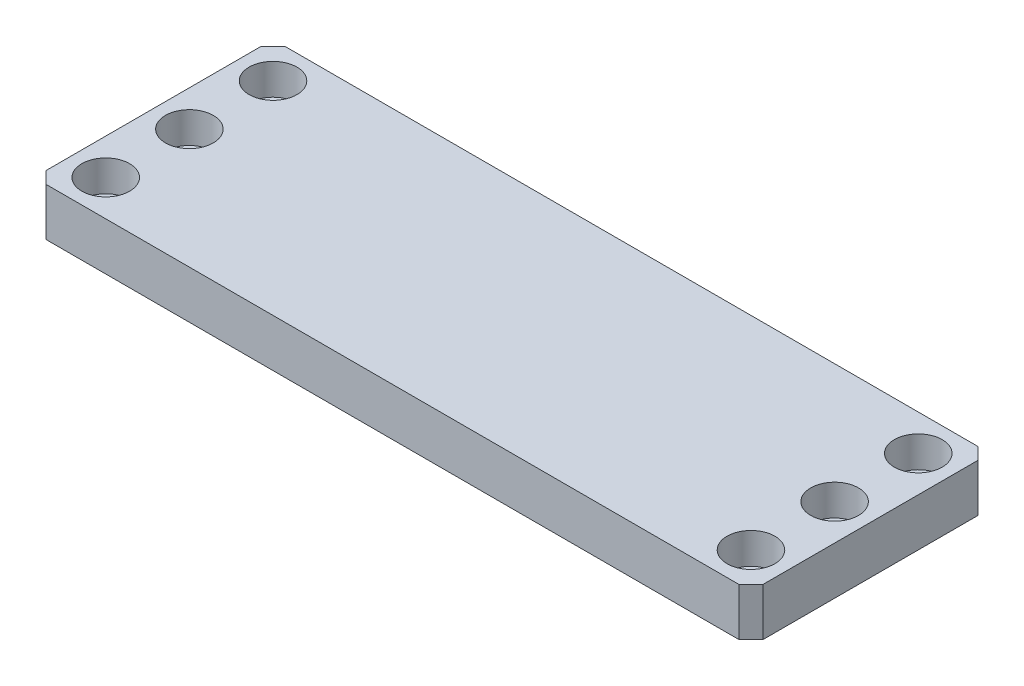
ISO-10303-21;
HEADER;
FILE_DESCRIPTION(('STEP AP214'),'2;1');
FILE_NAME('part.step','',(''),(''),'','','');
FILE_SCHEMA(('AUTOMOTIVE_DESIGN { 1 0 10303 214 1 1 1 1 }'));
ENDSEC;
DATA;
#1=APPLICATION_CONTEXT('core data for automotive mechanical design processes');
#2=APPLICATION_PROTOCOL_DEFINITION('international standard','automotive_design',2000,#1);
#3=PRODUCT_CONTEXT('',#1,'mechanical');
#4=PRODUCT('Part','Part','',(#3));
#5=PRODUCT_RELATED_PRODUCT_CATEGORY('part','',(#4));
#6=PRODUCT_DEFINITION_FORMATION('','',#4);
#7=PRODUCT_DEFINITION_CONTEXT('part definition',#1,'design');
#8=PRODUCT_DEFINITION('design','',#6,#7);
#9=PRODUCT_DEFINITION_SHAPE('','',#8);
#10=(LENGTH_UNIT() NAMED_UNIT(*) SI_UNIT(.MILLI.,.METRE.));
#11=(NAMED_UNIT(*) PLANE_ANGLE_UNIT() SI_UNIT($,.RADIAN.));
#12=(NAMED_UNIT(*) SI_UNIT($,.STERADIAN.) SOLID_ANGLE_UNIT());
#13=UNCERTAINTY_MEASURE_WITH_UNIT(LENGTH_MEASURE(1.E-05),#10,'distance_accuracy_value','');
#14=(GEOMETRIC_REPRESENTATION_CONTEXT(3) GLOBAL_UNCERTAINTY_ASSIGNED_CONTEXT((#13)) GLOBAL_UNIT_ASSIGNED_CONTEXT((#10,
#11,#12)) REPRESENTATION_CONTEXT('',''));
#15=CARTESIAN_POINT('',(0.,0.,0.));
#16=DIRECTION('',(0.,0.,1.));
#17=DIRECTION('',(1.,0.,0.));
#18=AXIS2_PLACEMENT_3D('',#15,#16,#17);
#19=CARTESIAN_POINT('',(-150.,20.,50.));
#20=DIRECTION('',(1.,0.,0.));
#21=DIRECTION('',(0.,0.,-1.));
#22=AXIS2_PLACEMENT_3D('',#19,#20,#21);
#23=PLANE('',#22);
#24=DIRECTION('',(0.,0.,1.));
#25=VECTOR('',#24,1.);
#26=CARTESIAN_POINT('',(-150.,20.,50.));
#27=LINE('',#26,#25);
#28=CARTESIAN_POINT('',(-150.,20.,-45.));
#29=VERTEX_POINT('',#28);
#30=CARTESIAN_POINT('',(-150.,20.,45.));
#31=VERTEX_POINT('',#30);
#32=EDGE_CURVE('E266',#29,#31,#27,.T.);
#33=ORIENTED_EDGE('',*,*,#32,.F.);
#34=DIRECTION('',(0.,-1.,0.));
#35=VECTOR('',#34,1.);
#36=CARTESIAN_POINT('',(-150.,20.,-45.));
#37=LINE('',#36,#35);
#38=CARTESIAN_POINT('',(-150.,0.,-45.));
#39=VERTEX_POINT('',#38);
#40=EDGE_CURVE('E11',#29,#39,#37,.T.);
#41=ORIENTED_EDGE('',*,*,#40,.T.);
#42=DIRECTION('',(0.,0.,1.));
#43=VECTOR('',#42,1.);
#44=CARTESIAN_POINT('',(-150.,0.,50.));
#45=LINE('',#44,#43);
#46=CARTESIAN_POINT('',(-150.,0.,45.));
#47=VERTEX_POINT('',#46);
#48=EDGE_CURVE('E265',#39,#47,#45,.T.);
#49=ORIENTED_EDGE('',*,*,#48,.T.);
#50=DIRECTION('',(0.,1.,0.));
#51=VECTOR('',#50,1.);
#52=CARTESIAN_POINT('',(-150.,20.,45.));
#53=LINE('',#52,#51);
#54=EDGE_CURVE('E59',#47,#31,#53,.T.);
#55=ORIENTED_EDGE('',*,*,#54,.T.);
#56=EDGE_LOOP('',(#33,#41,#49,#55));
#57=FACE_BOUND('',#56,.T.);
#58=ADVANCED_FACE('F49',(#57),#23,.F.);
#59=CARTESIAN_POINT('',(150.,20.,50.));
#60=DIRECTION('',(0.,0.,-1.));
#61=DIRECTION('',(-1.,0.,0.));
#62=AXIS2_PLACEMENT_3D('',#59,#60,#61);
#63=PLANE('',#62);
#64=DIRECTION('',(1.,0.,0.));
#65=VECTOR('',#64,1.);
#66=CARTESIAN_POINT('',(150.,0.,50.));
#67=LINE('',#66,#65);
#68=CARTESIAN_POINT('',(-145.,0.,50.));
#69=VERTEX_POINT('',#68);
#70=CARTESIAN_POINT('',(145.,0.,50.));
#71=VERTEX_POINT('',#70);
#72=EDGE_CURVE('E285',#69,#71,#67,.T.);
#73=ORIENTED_EDGE('',*,*,#72,.T.);
#74=DIRECTION('',(0.,1.,0.));
#75=VECTOR('',#74,1.);
#76=CARTESIAN_POINT('',(145.,20.,50.));
#77=LINE('',#76,#75);
#78=CARTESIAN_POINT('',(145.,20.,50.));
#79=VERTEX_POINT('',#78);
#80=EDGE_CURVE('E66',#71,#79,#77,.T.);
#81=ORIENTED_EDGE('',*,*,#80,.T.);
#82=DIRECTION('',(1.,0.,0.));
#83=VECTOR('',#82,1.);
#84=CARTESIAN_POINT('',(150.,20.,50.));
#85=LINE('',#84,#83);
#86=CARTESIAN_POINT('',(-145.,20.,50.));
#87=VERTEX_POINT('',#86);
#88=EDGE_CURVE('E269',#87,#79,#85,.T.);
#89=ORIENTED_EDGE('',*,*,#88,.F.);
#90=DIRECTION('',(0.,-1.,0.));
#91=VECTOR('',#90,1.);
#92=CARTESIAN_POINT('',(-145.,20.,50.));
#93=LINE('',#92,#91);
#94=EDGE_CURVE('E331',#87,#69,#93,.T.);
#95=ORIENTED_EDGE('',*,*,#94,.T.);
#96=EDGE_LOOP('',(#73,#81,#89,#95));
#97=FACE_BOUND('',#96,.T.);
#98=ADVANCED_FACE('F347',(#97),#63,.F.);
#99=CARTESIAN_POINT('',(150.,20.,50.));
#100=DIRECTION('',(-1.,0.,0.));
#101=DIRECTION('',(0.,0.,1.));
#102=AXIS2_PLACEMENT_3D('',#99,#100,#101);
#103=PLANE('',#102);
#104=DIRECTION('',(0.,0.,-1.));
#105=VECTOR('',#104,1.);
#106=CARTESIAN_POINT('',(150.,0.,50.));
#107=LINE('',#106,#105);
#108=CARTESIAN_POINT('',(150.,0.,45.));
#109=VERTEX_POINT('',#108);
#110=CARTESIAN_POINT('',(150.,0.,-45.));
#111=VERTEX_POINT('',#110);
#112=EDGE_CURVE('E288',#109,#111,#107,.T.);
#113=ORIENTED_EDGE('',*,*,#112,.T.);
#114=DIRECTION('',(0.,1.,0.));
#115=VECTOR('',#114,1.);
#116=CARTESIAN_POINT('',(150.,20.,-45.));
#117=LINE('',#116,#115);
#118=CARTESIAN_POINT('',(150.,20.,-45.));
#119=VERTEX_POINT('',#118);
#120=EDGE_CURVE('E317',#111,#119,#117,.T.);
#121=ORIENTED_EDGE('',*,*,#120,.T.);
#122=DIRECTION('',(0.,0.,-1.));
#123=VECTOR('',#122,1.);
#124=CARTESIAN_POINT('',(150.,20.,50.));
#125=LINE('',#124,#123);
#126=CARTESIAN_POINT('',(150.,20.,45.));
#127=VERTEX_POINT('',#126);
#128=EDGE_CURVE('E273',#127,#119,#125,.T.);
#129=ORIENTED_EDGE('',*,*,#128,.F.);
#130=DIRECTION('',(0.,-1.,0.));
#131=VECTOR('',#130,1.);
#132=CARTESIAN_POINT('',(150.,20.,45.));
#133=LINE('',#132,#131);
#134=EDGE_CURVE('E313',#127,#109,#133,.T.);
#135=ORIENTED_EDGE('',*,*,#134,.T.);
#136=EDGE_LOOP('',(#113,#121,#129,#135));
#137=FACE_BOUND('',#136,.T.);
#138=ADVANCED_FACE('F358',(#137),#103,.F.);
#139=CARTESIAN_POINT('',(150.,20.,-50.));
#140=DIRECTION('',(0.,0.,1.));
#141=DIRECTION('',(1.,0.,0.));
#142=AXIS2_PLACEMENT_3D('',#139,#140,#141);
#143=PLANE('',#142);
#144=DIRECTION('',(-1.,0.,0.));
#145=VECTOR('',#144,1.);
#146=CARTESIAN_POINT('',(150.,20.,-50.));
#147=LINE('',#146,#145);
#148=CARTESIAN_POINT('',(145.,20.,-50.));
#149=VERTEX_POINT('',#148);
#150=CARTESIAN_POINT('',(-145.,20.,-50.));
#151=VERTEX_POINT('',#150);
#152=EDGE_CURVE('E277',#149,#151,#147,.T.);
#153=ORIENTED_EDGE('',*,*,#152,.F.);
#154=DIRECTION('',(0.,-1.,0.));
#155=VECTOR('',#154,1.);
#156=CARTESIAN_POINT('',(145.,20.,-50.));
#157=LINE('',#156,#155);
#158=CARTESIAN_POINT('',(145.,0.,-50.));
#159=VERTEX_POINT('',#158);
#160=EDGE_CURVE('E297',#149,#159,#157,.T.);
#161=ORIENTED_EDGE('',*,*,#160,.T.);
#162=DIRECTION('',(-1.,0.,0.));
#163=VECTOR('',#162,1.);
#164=CARTESIAN_POINT('',(150.,0.,-50.));
#165=LINE('',#164,#163);
#166=CARTESIAN_POINT('',(-145.,0.,-50.));
#167=VERTEX_POINT('',#166);
#168=EDGE_CURVE('E270',#159,#167,#165,.T.);
#169=ORIENTED_EDGE('',*,*,#168,.T.);
#170=DIRECTION('',(0.,1.,0.));
#171=VECTOR('',#170,1.);
#172=CARTESIAN_POINT('',(-145.,20.,-50.));
#173=LINE('',#172,#171);
#174=EDGE_CURVE('E281',#167,#151,#173,.T.);
#175=ORIENTED_EDGE('',*,*,#174,.T.);
#176=EDGE_LOOP('',(#153,#161,#169,#175));
#177=FACE_BOUND('',#176,.T.);
#178=ADVANCED_FACE('F366',(#177),#143,.F.);
#179=CARTESIAN_POINT('',(0.,20.,0.));
#180=DIRECTION('',(0.,1.,0.));
#181=DIRECTION('',(0.,0.,1.));
#182=AXIS2_PLACEMENT_3D('',#179,#180,#181);
#183=PLANE('',#182);
#184=CARTESIAN_POINT('',(-135.,20.,-35.));
#185=DIRECTION('',(0.,1.,0.));
#186=DIRECTION('',(0.,0.,1.));
#187=AXIS2_PLACEMENT_3D('',#184,#185,#186);
#188=CIRCLE('',#187,10.);
#189=CARTESIAN_POINT('',(-135.,20.,-25.));
#190=VERTEX_POINT('',#189);
#191=EDGE_CURVE('E169',#190,#190,#188,.T.);
#192=ORIENTED_EDGE('',*,*,#191,.F.);
#193=EDGE_LOOP('',(#192));
#194=FACE_BOUND('',#193,.T.);
#195=CARTESIAN_POINT('',(-135.,20.,35.));
#196=DIRECTION('',(0.,1.,0.));
#197=DIRECTION('',(0.,0.,1.));
#198=AXIS2_PLACEMENT_3D('',#195,#196,#197);
#199=CIRCLE('',#198,10.);
#200=CARTESIAN_POINT('',(-135.,20.,45.));
#201=VERTEX_POINT('',#200);
#202=EDGE_CURVE('E185',#201,#201,#199,.T.);
#203=ORIENTED_EDGE('',*,*,#202,.F.);
#204=EDGE_LOOP('',(#203));
#205=FACE_BOUND('',#204,.T.);
#206=CARTESIAN_POINT('',(-135.,20.,0.));
#207=DIRECTION('',(0.,1.,0.));
#208=DIRECTION('',(0.,0.,1.));
#209=AXIS2_PLACEMENT_3D('',#206,#207,#208);
#210=CIRCLE('',#209,10.);
#211=CARTESIAN_POINT('',(-135.,20.,10.));
#212=VERTEX_POINT('',#211);
#213=EDGE_CURVE('E201',#212,#212,#210,.T.);
#214=ORIENTED_EDGE('',*,*,#213,.F.);
#215=EDGE_LOOP('',(#214));
#216=FACE_BOUND('',#215,.T.);
#217=CARTESIAN_POINT('',(135.,20.,0.));
#218=DIRECTION('',(0.,1.,0.));
#219=DIRECTION('',(0.,0.,1.));
#220=AXIS2_PLACEMENT_3D('',#217,#218,#219);
#221=CIRCLE('',#220,10.);
#222=CARTESIAN_POINT('',(135.,20.,10.));
#223=VERTEX_POINT('',#222);
#224=EDGE_CURVE('E217',#223,#223,#221,.T.);
#225=ORIENTED_EDGE('',*,*,#224,.F.);
#226=EDGE_LOOP('',(#225));
#227=FACE_BOUND('',#226,.T.);
#228=CARTESIAN_POINT('',(135.,20.,35.));
#229=DIRECTION('',(0.,1.,0.));
#230=DIRECTION('',(0.,0.,1.));
#231=AXIS2_PLACEMENT_3D('',#228,#229,#230);
#232=CIRCLE('',#231,10.);
#233=CARTESIAN_POINT('',(135.,20.,45.));
#234=VERTEX_POINT('',#233);
#235=EDGE_CURVE('E233',#234,#234,#232,.T.);
#236=ORIENTED_EDGE('',*,*,#235,.F.);
#237=EDGE_LOOP('',(#236));
#238=FACE_BOUND('',#237,.T.);
#239=CARTESIAN_POINT('',(135.,20.,-35.));
#240=DIRECTION('',(0.,1.,0.));
#241=DIRECTION('',(0.,0.,1.));
#242=AXIS2_PLACEMENT_3D('',#239,#240,#241);
#243=CIRCLE('',#242,10.);
#244=CARTESIAN_POINT('',(135.,20.,-25.));
#245=VERTEX_POINT('',#244);
#246=EDGE_CURVE('E249',#245,#245,#243,.T.);
#247=ORIENTED_EDGE('',*,*,#246,.F.);
#248=EDGE_LOOP('',(#247));
#249=FACE_BOUND('',#248,.T.);
#250=ORIENTED_EDGE('',*,*,#128,.T.);
#251=DIRECTION('',(0.707106781186544,0.,0.707106781186551));
#252=VECTOR('',#251,1.);
#253=CARTESIAN_POINT('',(97.5000000000009,20.,-97.4999999999998));
#254=LINE('',#253,#252);
#255=EDGE_CURVE('E328',#119,#149,#254,.F.);
#256=ORIENTED_EDGE('',*,*,#255,.T.);
#257=ORIENTED_EDGE('',*,*,#152,.T.);
#258=DIRECTION('',(0.70710678118655,0.,-0.707106781186545));
#259=VECTOR('',#258,1.);
#260=CARTESIAN_POINT('',(-97.4999999999994,20.,-97.5000000000002));
#261=LINE('',#260,#259);
#262=EDGE_CURVE('E322',#151,#29,#261,.F.);
#263=ORIENTED_EDGE('',*,*,#262,.T.);
#264=ORIENTED_EDGE('',*,*,#32,.T.);
#265=DIRECTION('',(-0.707106781186544,0.,-0.707106781186551));
#266=VECTOR('',#265,1.);
#267=CARTESIAN_POINT('',(-97.5000000000008,20.,97.4999999999997));
#268=LINE('',#267,#266);
#269=EDGE_CURVE('E73',#31,#87,#268,.F.);
#270=ORIENTED_EDGE('',*,*,#269,.T.);
#271=ORIENTED_EDGE('',*,*,#88,.T.);
#272=DIRECTION('',(-0.707106781186548,0.,0.707106781186548));
#273=VECTOR('',#272,1.);
#274=CARTESIAN_POINT('',(97.5,20.,97.5));
#275=LINE('',#274,#273);
#276=EDGE_CURVE('E325',#79,#127,#275,.F.);
#277=ORIENTED_EDGE('',*,*,#276,.T.);
#278=EDGE_LOOP('',(#250,#256,#257,#263,#264,#270,#271,#277));
#279=FACE_BOUND('',#278,.T.);
#280=ADVANCED_FACE('F343',(#194,#205,#216,#227,#238,#249,#279),#183,.T.);
#281=CARTESIAN_POINT('',(0.,0.,0.));
#282=DIRECTION('',(0.,1.,0.));
#283=DIRECTION('',(0.,0.,1.));
#284=AXIS2_PLACEMENT_3D('',#281,#282,#283);
#285=PLANE('',#284);
#286=CARTESIAN_POINT('',(37.8,0.,-37.8));
#287=DIRECTION('',(0.,-1.,0.));
#288=DIRECTION('',(0.,0.,-1.));
#289=AXIS2_PLACEMENT_3D('',#286,#287,#288);
#290=CIRCLE('',#289,3.39999999999999);
#291=CARTESIAN_POINT('',(37.8,0.,-41.2));
#292=VERTEX_POINT('',#291);
#293=EDGE_CURVE('E140',#292,#292,#290,.T.);
#294=ORIENTED_EDGE('',*,*,#293,.F.);
#295=EDGE_LOOP('',(#294));
#296=FACE_BOUND('',#295,.T.);
#297=CARTESIAN_POINT('',(-37.8,0.,-37.8));
#298=DIRECTION('',(0.,-1.,0.));
#299=DIRECTION('',(0.,0.,-1.));
#300=AXIS2_PLACEMENT_3D('',#297,#298,#299);
#301=CIRCLE('',#300,3.39999999999999);
#302=CARTESIAN_POINT('',(-37.8,0.,-41.2));
#303=VERTEX_POINT('',#302);
#304=EDGE_CURVE('E139',#303,#303,#301,.T.);
#305=ORIENTED_EDGE('',*,*,#304,.F.);
#306=EDGE_LOOP('',(#305));
#307=FACE_BOUND('',#306,.T.);
#308=CARTESIAN_POINT('',(-37.8,0.,37.8));
#309=DIRECTION('',(0.,-1.,0.));
#310=DIRECTION('',(0.,0.,-1.));
#311=AXIS2_PLACEMENT_3D('',#308,#309,#310);
#312=CIRCLE('',#311,3.39999999999999);
#313=CARTESIAN_POINT('',(-37.8,0.,34.4));
#314=VERTEX_POINT('',#313);
#315=EDGE_CURVE('E153',#314,#314,#312,.T.);
#316=ORIENTED_EDGE('',*,*,#315,.F.);
#317=EDGE_LOOP('',(#316));
#318=FACE_BOUND('',#317,.T.);
#319=CARTESIAN_POINT('',(37.8,0.,37.8));
#320=DIRECTION('',(0.,-1.,0.));
#321=DIRECTION('',(0.,0.,-1.));
#322=AXIS2_PLACEMENT_3D('',#319,#320,#321);
#323=CIRCLE('',#322,3.39999999999999);
#324=CARTESIAN_POINT('',(37.8,0.,34.4));
#325=VERTEX_POINT('',#324);
#326=EDGE_CURVE('E161',#325,#325,#323,.T.);
#327=ORIENTED_EDGE('',*,*,#326,.F.);
#328=EDGE_LOOP('',(#327));
#329=FACE_BOUND('',#328,.T.);
#330=CARTESIAN_POINT('',(-135.,0.,-35.));
#331=DIRECTION('',(0.,1.,0.));
#332=DIRECTION('',(0.,0.,1.));
#333=AXIS2_PLACEMENT_3D('',#330,#331,#332);
#334=CIRCLE('',#333,6.75000000000001);
#335=CARTESIAN_POINT('',(-135.,0.,-28.25));
#336=VERTEX_POINT('',#335);
#337=EDGE_CURVE('E181',#336,#336,#334,.T.);
#338=ORIENTED_EDGE('',*,*,#337,.T.);
#339=EDGE_LOOP('',(#338));
#340=FACE_BOUND('',#339,.T.);
#341=CARTESIAN_POINT('',(-135.,0.,35.));
#342=DIRECTION('',(0.,1.,0.));
#343=DIRECTION('',(0.,0.,1.));
#344=AXIS2_PLACEMENT_3D('',#341,#342,#343);
#345=CIRCLE('',#344,6.75000000000001);
#346=CARTESIAN_POINT('',(-135.,0.,41.75));
#347=VERTEX_POINT('',#346);
#348=EDGE_CURVE('E197',#347,#347,#345,.T.);
#349=ORIENTED_EDGE('',*,*,#348,.T.);
#350=EDGE_LOOP('',(#349));
#351=FACE_BOUND('',#350,.T.);
#352=CARTESIAN_POINT('',(-135.,0.,0.));
#353=DIRECTION('',(0.,1.,0.));
#354=DIRECTION('',(0.,0.,1.));
#355=AXIS2_PLACEMENT_3D('',#352,#353,#354);
#356=CIRCLE('',#355,6.75000000000001);
#357=CARTESIAN_POINT('',(-135.,0.,6.75000000000001));
#358=VERTEX_POINT('',#357);
#359=EDGE_CURVE('E213',#358,#358,#356,.T.);
#360=ORIENTED_EDGE('',*,*,#359,.T.);
#361=EDGE_LOOP('',(#360));
#362=FACE_BOUND('',#361,.T.);
#363=CARTESIAN_POINT('',(135.,0.,0.));
#364=DIRECTION('',(0.,1.,0.));
#365=DIRECTION('',(0.,0.,1.));
#366=AXIS2_PLACEMENT_3D('',#363,#364,#365);
#367=CIRCLE('',#366,6.75000000000001);
#368=CARTESIAN_POINT('',(135.,0.,6.75000000000001));
#369=VERTEX_POINT('',#368);
#370=EDGE_CURVE('E229',#369,#369,#367,.T.);
#371=ORIENTED_EDGE('',*,*,#370,.T.);
#372=EDGE_LOOP('',(#371));
#373=FACE_BOUND('',#372,.T.);
#374=CARTESIAN_POINT('',(135.,0.,35.));
#375=DIRECTION('',(0.,1.,0.));
#376=DIRECTION('',(0.,0.,1.));
#377=AXIS2_PLACEMENT_3D('',#374,#375,#376);
#378=CIRCLE('',#377,6.75000000000001);
#379=CARTESIAN_POINT('',(135.,0.,41.75));
#380=VERTEX_POINT('',#379);
#381=EDGE_CURVE('E245',#380,#380,#378,.T.);
#382=ORIENTED_EDGE('',*,*,#381,.T.);
#383=EDGE_LOOP('',(#382));
#384=FACE_BOUND('',#383,.T.);
#385=CARTESIAN_POINT('',(135.,0.,-35.));
#386=DIRECTION('',(0.,1.,0.));
#387=DIRECTION('',(0.,0.,1.));
#388=AXIS2_PLACEMENT_3D('',#385,#386,#387);
#389=CIRCLE('',#388,6.75000000000001);
#390=CARTESIAN_POINT('',(135.,0.,-28.25));
#391=VERTEX_POINT('',#390);
#392=EDGE_CURVE('E261',#391,#391,#389,.T.);
#393=ORIENTED_EDGE('',*,*,#392,.T.);
#394=EDGE_LOOP('',(#393));
#395=FACE_BOUND('',#394,.T.);
#396=ORIENTED_EDGE('',*,*,#168,.F.);
#397=DIRECTION('',(-0.707106781186544,0.,-0.707106781186551));
#398=VECTOR('',#397,1.);
#399=CARTESIAN_POINT('',(145.,0.,-50.));
#400=LINE('',#399,#398);
#401=EDGE_CURVE('E310',#159,#111,#400,.F.);
#402=ORIENTED_EDGE('',*,*,#401,.T.);
#403=ORIENTED_EDGE('',*,*,#112,.F.);
#404=DIRECTION('',(0.707106781186548,0.,-0.707106781186548));
#405=VECTOR('',#404,1.);
#406=CARTESIAN_POINT('',(150.,0.,45.));
#407=LINE('',#406,#405);
#408=EDGE_CURVE('E307',#109,#71,#407,.F.);
#409=ORIENTED_EDGE('',*,*,#408,.T.);
#410=ORIENTED_EDGE('',*,*,#72,.F.);
#411=DIRECTION('',(0.707106781186544,0.,0.707106781186551));
#412=VECTOR('',#411,1.);
#413=CARTESIAN_POINT('',(-145.,0.,50.));
#414=LINE('',#413,#412);
#415=EDGE_CURVE('E301',#69,#47,#414,.F.);
#416=ORIENTED_EDGE('',*,*,#415,.T.);
#417=ORIENTED_EDGE('',*,*,#48,.F.);
#418=DIRECTION('',(-0.70710678118655,0.,0.707106781186545));
#419=VECTOR('',#418,1.);
#420=CARTESIAN_POINT('',(-150.,0.,-45.));
#421=LINE('',#420,#419);
#422=EDGE_CURVE('E304',#39,#167,#421,.F.);
#423=ORIENTED_EDGE('',*,*,#422,.T.);
#424=EDGE_LOOP('',(#396,#402,#403,#409,#410,#416,#417,#423));
#425=FACE_BOUND('',#424,.T.);
#426=ADVANCED_FACE('F350',(#296,#307,#318,#329,#340,#351,#362,#373,#384,#395,#425),#285,.F.);
#427=CARTESIAN_POINT('',(135.,20.,-35.));
#428=DIRECTION('',(0.,1.,0.));
#429=DIRECTION('',(0.,0.,1.));
#430=AXIS2_PLACEMENT_3D('',#427,#428,#429);
#431=CYLINDRICAL_SURFACE('',#430,6.75000000000001);
#432=ORIENTED_EDGE('',*,*,#392,.F.);
#433=EDGE_LOOP('',(#432));
#434=FACE_BOUND('',#433,.T.);
#435=CARTESIAN_POINT('',(135.,7.,-35.));
#436=DIRECTION('',(0.,1.,0.));
#437=DIRECTION('',(0.,0.,1.));
#438=AXIS2_PLACEMENT_3D('',#435,#436,#437);
#439=CIRCLE('',#438,6.75000000000001);
#440=CARTESIAN_POINT('',(135.,7.,-28.25));
#441=VERTEX_POINT('',#440);
#442=EDGE_CURVE('E257',#441,#441,#439,.T.);
#443=ORIENTED_EDGE('',*,*,#442,.T.);
#444=EDGE_LOOP('',(#443));
#445=FACE_BOUND('',#444,.T.);
#446=ADVANCED_FACE('F473',(#434,#445),#431,.F.);
#447=CARTESIAN_POINT('',(141.75,7.,-35.));
#448=DIRECTION('',(0.,-1.,0.));
#449=DIRECTION('',(0.,0.,-1.));
#450=AXIS2_PLACEMENT_3D('',#447,#448,#449);
#451=PLANE('',#450);
#452=ORIENTED_EDGE('',*,*,#442,.F.);
#453=EDGE_LOOP('',(#452));
#454=FACE_BOUND('',#453,.T.);
#455=CARTESIAN_POINT('',(135.,7.,-35.));
#456=DIRECTION('',(0.,1.,0.));
#457=DIRECTION('',(0.,0.,1.));
#458=AXIS2_PLACEMENT_3D('',#455,#456,#457);
#459=CIRCLE('',#458,10.);
#460=CARTESIAN_POINT('',(135.,7.,-25.));
#461=VERTEX_POINT('',#460);
#462=EDGE_CURVE('E253',#461,#461,#459,.T.);
#463=ORIENTED_EDGE('',*,*,#462,.T.);
#464=EDGE_LOOP('',(#463));
#465=FACE_BOUND('',#464,.T.);
#466=ADVANCED_FACE('F469',(#454,#465),#451,.F.);
#467=CARTESIAN_POINT('',(135.,20.,-35.));
#468=DIRECTION('',(0.,1.,0.));
#469=DIRECTION('',(0.,0.,1.));
#470=AXIS2_PLACEMENT_3D('',#467,#468,#469);
#471=CYLINDRICAL_SURFACE('',#470,10.);
#472=ORIENTED_EDGE('',*,*,#462,.F.);
#473=EDGE_LOOP('',(#472));
#474=FACE_BOUND('',#473,.T.);
#475=ORIENTED_EDGE('',*,*,#246,.T.);
#476=EDGE_LOOP('',(#475));
#477=FACE_BOUND('',#476,.T.);
#478=ADVANCED_FACE('F465',(#474,#477),#471,.F.);
#479=CARTESIAN_POINT('',(135.,20.,35.));
#480=DIRECTION('',(0.,1.,0.));
#481=DIRECTION('',(0.,0.,1.));
#482=AXIS2_PLACEMENT_3D('',#479,#480,#481);
#483=CYLINDRICAL_SURFACE('',#482,6.75000000000001);
#484=ORIENTED_EDGE('',*,*,#381,.F.);
#485=EDGE_LOOP('',(#484));
#486=FACE_BOUND('',#485,.T.);
#487=CARTESIAN_POINT('',(135.,7.,35.));
#488=DIRECTION('',(0.,1.,0.));
#489=DIRECTION('',(0.,0.,1.));
#490=AXIS2_PLACEMENT_3D('',#487,#488,#489);
#491=CIRCLE('',#490,6.75000000000001);
#492=CARTESIAN_POINT('',(135.,7.,41.75));
#493=VERTEX_POINT('',#492);
#494=EDGE_CURVE('E241',#493,#493,#491,.T.);
#495=ORIENTED_EDGE('',*,*,#494,.T.);
#496=EDGE_LOOP('',(#495));
#497=FACE_BOUND('',#496,.T.);
#498=ADVANCED_FACE('F461',(#486,#497),#483,.F.);
#499=CARTESIAN_POINT('',(141.75,7.,35.));
#500=DIRECTION('',(0.,-1.,0.));
#501=DIRECTION('',(0.,0.,-1.));
#502=AXIS2_PLACEMENT_3D('',#499,#500,#501);
#503=PLANE('',#502);
#504=ORIENTED_EDGE('',*,*,#494,.F.);
#505=EDGE_LOOP('',(#504));
#506=FACE_BOUND('',#505,.T.);
#507=CARTESIAN_POINT('',(135.,7.,35.));
#508=DIRECTION('',(0.,1.,0.));
#509=DIRECTION('',(0.,0.,1.));
#510=AXIS2_PLACEMENT_3D('',#507,#508,#509);
#511=CIRCLE('',#510,10.);
#512=CARTESIAN_POINT('',(135.,7.,45.));
#513=VERTEX_POINT('',#512);
#514=EDGE_CURVE('E237',#513,#513,#511,.T.);
#515=ORIENTED_EDGE('',*,*,#514,.T.);
#516=EDGE_LOOP('',(#515));
#517=FACE_BOUND('',#516,.T.);
#518=ADVANCED_FACE('F457',(#506,#517),#503,.F.);
#519=CARTESIAN_POINT('',(135.,20.,35.));
#520=DIRECTION('',(0.,1.,0.));
#521=DIRECTION('',(0.,0.,1.));
#522=AXIS2_PLACEMENT_3D('',#519,#520,#521);
#523=CYLINDRICAL_SURFACE('',#522,10.);
#524=ORIENTED_EDGE('',*,*,#514,.F.);
#525=EDGE_LOOP('',(#524));
#526=FACE_BOUND('',#525,.T.);
#527=ORIENTED_EDGE('',*,*,#235,.T.);
#528=EDGE_LOOP('',(#527));
#529=FACE_BOUND('',#528,.T.);
#530=ADVANCED_FACE('F453',(#526,#529),#523,.F.);
#531=CARTESIAN_POINT('',(135.,20.,0.));
#532=DIRECTION('',(0.,1.,0.));
#533=DIRECTION('',(0.,0.,1.));
#534=AXIS2_PLACEMENT_3D('',#531,#532,#533);
#535=CYLINDRICAL_SURFACE('',#534,6.75000000000001);
#536=ORIENTED_EDGE('',*,*,#370,.F.);
#537=EDGE_LOOP('',(#536));
#538=FACE_BOUND('',#537,.T.);
#539=CARTESIAN_POINT('',(135.,7.,0.));
#540=DIRECTION('',(0.,1.,0.));
#541=DIRECTION('',(0.,0.,1.));
#542=AXIS2_PLACEMENT_3D('',#539,#540,#541);
#543=CIRCLE('',#542,6.75000000000001);
#544=CARTESIAN_POINT('',(135.,7.,6.75000000000001));
#545=VERTEX_POINT('',#544);
#546=EDGE_CURVE('E225',#545,#545,#543,.T.);
#547=ORIENTED_EDGE('',*,*,#546,.T.);
#548=EDGE_LOOP('',(#547));
#549=FACE_BOUND('',#548,.T.);
#550=ADVANCED_FACE('F449',(#538,#549),#535,.F.);
#551=CARTESIAN_POINT('',(141.75,7.,0.));
#552=DIRECTION('',(0.,-1.,0.));
#553=DIRECTION('',(0.,0.,-1.));
#554=AXIS2_PLACEMENT_3D('',#551,#552,#553);
#555=PLANE('',#554);
#556=ORIENTED_EDGE('',*,*,#546,.F.);
#557=EDGE_LOOP('',(#556));
#558=FACE_BOUND('',#557,.T.);
#559=CARTESIAN_POINT('',(135.,7.,0.));
#560=DIRECTION('',(0.,1.,0.));
#561=DIRECTION('',(0.,0.,1.));
#562=AXIS2_PLACEMENT_3D('',#559,#560,#561);
#563=CIRCLE('',#562,10.);
#564=CARTESIAN_POINT('',(135.,7.,10.));
#565=VERTEX_POINT('',#564);
#566=EDGE_CURVE('E221',#565,#565,#563,.T.);
#567=ORIENTED_EDGE('',*,*,#566,.T.);
#568=EDGE_LOOP('',(#567));
#569=FACE_BOUND('',#568,.T.);
#570=ADVANCED_FACE('F445',(#558,#569),#555,.F.);
#571=CARTESIAN_POINT('',(135.,20.,0.));
#572=DIRECTION('',(0.,1.,0.));
#573=DIRECTION('',(0.,0.,1.));
#574=AXIS2_PLACEMENT_3D('',#571,#572,#573);
#575=CYLINDRICAL_SURFACE('',#574,10.);
#576=ORIENTED_EDGE('',*,*,#566,.F.);
#577=EDGE_LOOP('',(#576));
#578=FACE_BOUND('',#577,.T.);
#579=ORIENTED_EDGE('',*,*,#224,.T.);
#580=EDGE_LOOP('',(#579));
#581=FACE_BOUND('',#580,.T.);
#582=ADVANCED_FACE('F441',(#578,#581),#575,.F.);
#583=CARTESIAN_POINT('',(-135.,20.,0.));
#584=DIRECTION('',(0.,1.,0.));
#585=DIRECTION('',(0.,0.,1.));
#586=AXIS2_PLACEMENT_3D('',#583,#584,#585);
#587=CYLINDRICAL_SURFACE('',#586,6.75000000000001);
#588=ORIENTED_EDGE('',*,*,#359,.F.);
#589=EDGE_LOOP('',(#588));
#590=FACE_BOUND('',#589,.T.);
#591=CARTESIAN_POINT('',(-135.,7.,0.));
#592=DIRECTION('',(0.,1.,0.));
#593=DIRECTION('',(0.,0.,1.));
#594=AXIS2_PLACEMENT_3D('',#591,#592,#593);
#595=CIRCLE('',#594,6.75000000000001);
#596=CARTESIAN_POINT('',(-135.,7.,6.75000000000001));
#597=VERTEX_POINT('',#596);
#598=EDGE_CURVE('E209',#597,#597,#595,.T.);
#599=ORIENTED_EDGE('',*,*,#598,.T.);
#600=EDGE_LOOP('',(#599));
#601=FACE_BOUND('',#600,.T.);
#602=ADVANCED_FACE('F437',(#590,#601),#587,.F.);
#603=CARTESIAN_POINT('',(-128.25,7.,0.));
#604=DIRECTION('',(0.,-1.,0.));
#605=DIRECTION('',(0.,0.,-1.));
#606=AXIS2_PLACEMENT_3D('',#603,#604,#605);
#607=PLANE('',#606);
#608=ORIENTED_EDGE('',*,*,#598,.F.);
#609=EDGE_LOOP('',(#608));
#610=FACE_BOUND('',#609,.T.);
#611=CARTESIAN_POINT('',(-135.,7.,0.));
#612=DIRECTION('',(0.,1.,0.));
#613=DIRECTION('',(0.,0.,1.));
#614=AXIS2_PLACEMENT_3D('',#611,#612,#613);
#615=CIRCLE('',#614,10.);
#616=CARTESIAN_POINT('',(-135.,7.,10.));
#617=VERTEX_POINT('',#616);
#618=EDGE_CURVE('E205',#617,#617,#615,.T.);
#619=ORIENTED_EDGE('',*,*,#618,.T.);
#620=EDGE_LOOP('',(#619));
#621=FACE_BOUND('',#620,.T.);
#622=ADVANCED_FACE('F433',(#610,#621),#607,.F.);
#623=CARTESIAN_POINT('',(-135.,20.,0.));
#624=DIRECTION('',(0.,1.,0.));
#625=DIRECTION('',(0.,0.,1.));
#626=AXIS2_PLACEMENT_3D('',#623,#624,#625);
#627=CYLINDRICAL_SURFACE('',#626,10.);
#628=ORIENTED_EDGE('',*,*,#618,.F.);
#629=EDGE_LOOP('',(#628));
#630=FACE_BOUND('',#629,.T.);
#631=ORIENTED_EDGE('',*,*,#213,.T.);
#632=EDGE_LOOP('',(#631));
#633=FACE_BOUND('',#632,.T.);
#634=ADVANCED_FACE('F429',(#630,#633),#627,.F.);
#635=CARTESIAN_POINT('',(-135.,20.,35.));
#636=DIRECTION('',(0.,1.,0.));
#637=DIRECTION('',(0.,0.,1.));
#638=AXIS2_PLACEMENT_3D('',#635,#636,#637);
#639=CYLINDRICAL_SURFACE('',#638,6.75000000000001);
#640=ORIENTED_EDGE('',*,*,#348,.F.);
#641=EDGE_LOOP('',(#640));
#642=FACE_BOUND('',#641,.T.);
#643=CARTESIAN_POINT('',(-135.,7.,35.));
#644=DIRECTION('',(0.,1.,0.));
#645=DIRECTION('',(0.,0.,1.));
#646=AXIS2_PLACEMENT_3D('',#643,#644,#645);
#647=CIRCLE('',#646,6.75000000000001);
#648=CARTESIAN_POINT('',(-135.,7.,41.75));
#649=VERTEX_POINT('',#648);
#650=EDGE_CURVE('E193',#649,#649,#647,.T.);
#651=ORIENTED_EDGE('',*,*,#650,.T.);
#652=EDGE_LOOP('',(#651));
#653=FACE_BOUND('',#652,.T.);
#654=ADVANCED_FACE('F425',(#642,#653),#639,.F.);
#655=CARTESIAN_POINT('',(-128.25,7.,35.));
#656=DIRECTION('',(0.,-1.,0.));
#657=DIRECTION('',(0.,0.,-1.));
#658=AXIS2_PLACEMENT_3D('',#655,#656,#657);
#659=PLANE('',#658);
#660=ORIENTED_EDGE('',*,*,#650,.F.);
#661=EDGE_LOOP('',(#660));
#662=FACE_BOUND('',#661,.T.);
#663=CARTESIAN_POINT('',(-135.,7.,35.));
#664=DIRECTION('',(0.,1.,0.));
#665=DIRECTION('',(0.,0.,1.));
#666=AXIS2_PLACEMENT_3D('',#663,#664,#665);
#667=CIRCLE('',#666,10.);
#668=CARTESIAN_POINT('',(-135.,7.,45.));
#669=VERTEX_POINT('',#668);
#670=EDGE_CURVE('E189',#669,#669,#667,.T.);
#671=ORIENTED_EDGE('',*,*,#670,.T.);
#672=EDGE_LOOP('',(#671));
#673=FACE_BOUND('',#672,.T.);
#674=ADVANCED_FACE('F421',(#662,#673),#659,.F.);
#675=CARTESIAN_POINT('',(-135.,20.,35.));
#676=DIRECTION('',(0.,1.,0.));
#677=DIRECTION('',(0.,0.,1.));
#678=AXIS2_PLACEMENT_3D('',#675,#676,#677);
#679=CYLINDRICAL_SURFACE('',#678,10.);
#680=ORIENTED_EDGE('',*,*,#670,.F.);
#681=EDGE_LOOP('',(#680));
#682=FACE_BOUND('',#681,.T.);
#683=ORIENTED_EDGE('',*,*,#202,.T.);
#684=EDGE_LOOP('',(#683));
#685=FACE_BOUND('',#684,.T.);
#686=ADVANCED_FACE('F417',(#682,#685),#679,.F.);
#687=CARTESIAN_POINT('',(-135.,20.,-35.));
#688=DIRECTION('',(0.,1.,0.));
#689=DIRECTION('',(0.,0.,1.));
#690=AXIS2_PLACEMENT_3D('',#687,#688,#689);
#691=CYLINDRICAL_SURFACE('',#690,6.75000000000001);
#692=ORIENTED_EDGE('',*,*,#337,.F.);
#693=EDGE_LOOP('',(#692));
#694=FACE_BOUND('',#693,.T.);
#695=CARTESIAN_POINT('',(-135.,7.,-35.));
#696=DIRECTION('',(0.,1.,0.));
#697=DIRECTION('',(0.,0.,1.));
#698=AXIS2_PLACEMENT_3D('',#695,#696,#697);
#699=CIRCLE('',#698,6.75000000000001);
#700=CARTESIAN_POINT('',(-135.,7.,-28.25));
#701=VERTEX_POINT('',#700);
#702=EDGE_CURVE('E177',#701,#701,#699,.T.);
#703=ORIENTED_EDGE('',*,*,#702,.T.);
#704=EDGE_LOOP('',(#703));
#705=FACE_BOUND('',#704,.T.);
#706=ADVANCED_FACE('F407',(#694,#705),#691,.F.);
#707=CARTESIAN_POINT('',(-128.25,7.,-35.));
#708=DIRECTION('',(0.,-1.,0.));
#709=DIRECTION('',(0.,0.,-1.));
#710=AXIS2_PLACEMENT_3D('',#707,#708,#709);
#711=PLANE('',#710);
#712=ORIENTED_EDGE('',*,*,#702,.F.);
#713=EDGE_LOOP('',(#712));
#714=FACE_BOUND('',#713,.T.);
#715=CARTESIAN_POINT('',(-135.,7.,-35.));
#716=DIRECTION('',(0.,1.,0.));
#717=DIRECTION('',(0.,0.,1.));
#718=AXIS2_PLACEMENT_3D('',#715,#716,#717);
#719=CIRCLE('',#718,10.);
#720=CARTESIAN_POINT('',(-135.,7.,-25.));
#721=VERTEX_POINT('',#720);
#722=EDGE_CURVE('E173',#721,#721,#719,.T.);
#723=ORIENTED_EDGE('',*,*,#722,.T.);
#724=EDGE_LOOP('',(#723));
#725=FACE_BOUND('',#724,.T.);
#726=ADVANCED_FACE('F401',(#714,#725),#711,.F.);
#727=CARTESIAN_POINT('',(-135.,20.,-35.));
#728=DIRECTION('',(0.,1.,0.));
#729=DIRECTION('',(0.,0.,1.));
#730=AXIS2_PLACEMENT_3D('',#727,#728,#729);
#731=CYLINDRICAL_SURFACE('',#730,10.);
#732=ORIENTED_EDGE('',*,*,#722,.F.);
#733=EDGE_LOOP('',(#732));
#734=FACE_BOUND('',#733,.T.);
#735=ORIENTED_EDGE('',*,*,#191,.T.);
#736=EDGE_LOOP('',(#735));
#737=FACE_BOUND('',#736,.T.);
#738=ADVANCED_FACE('F391',(#734,#737),#731,.F.);
#739=CARTESIAN_POINT('',(145.,20.,-50.));
#740=DIRECTION('',(-0.707106781186551,0.,0.707106781186544));
#741=DIRECTION('',(0.,-1.,0.));
#742=AXIS2_PLACEMENT_3D('',#739,#740,#741);
#743=PLANE('',#742);
#744=ORIENTED_EDGE('',*,*,#255,.F.);
#745=ORIENTED_EDGE('',*,*,#120,.F.);
#746=ORIENTED_EDGE('',*,*,#401,.F.);
#747=ORIENTED_EDGE('',*,*,#160,.F.);
#748=EDGE_LOOP('',(#744,#745,#746,#747));
#749=FACE_BOUND('',#748,.T.);
#750=ADVANCED_FACE('F364',(#749),#743,.F.);
#751=CARTESIAN_POINT('',(150.,20.,45.));
#752=DIRECTION('',(-0.707106781186547,0.,-0.707106781186547));
#753=DIRECTION('',(0.,-1.,0.));
#754=AXIS2_PLACEMENT_3D('',#751,#752,#753);
#755=PLANE('',#754);
#756=ORIENTED_EDGE('',*,*,#276,.F.);
#757=ORIENTED_EDGE('',*,*,#80,.F.);
#758=ORIENTED_EDGE('',*,*,#408,.F.);
#759=ORIENTED_EDGE('',*,*,#134,.F.);
#760=EDGE_LOOP('',(#756,#757,#758,#759));
#761=FACE_BOUND('',#760,.T.);
#762=ADVANCED_FACE('F355',(#761),#755,.F.);
#763=CARTESIAN_POINT('',(-150.,20.,-45.));
#764=DIRECTION('',(0.707106781186545,0.,0.70710678118655));
#765=DIRECTION('',(0.,-1.,0.));
#766=AXIS2_PLACEMENT_3D('',#763,#764,#765);
#767=PLANE('',#766);
#768=ORIENTED_EDGE('',*,*,#262,.F.);
#769=ORIENTED_EDGE('',*,*,#174,.F.);
#770=ORIENTED_EDGE('',*,*,#422,.F.);
#771=ORIENTED_EDGE('',*,*,#40,.F.);
#772=EDGE_LOOP('',(#768,#769,#770,#771));
#773=FACE_BOUND('',#772,.T.);
#774=ADVANCED_FACE('F369',(#773),#767,.F.);
#775=CARTESIAN_POINT('',(-145.,20.,50.));
#776=DIRECTION('',(0.707106781186551,0.,-0.707106781186543));
#777=DIRECTION('',(0.,-1.,0.));
#778=AXIS2_PLACEMENT_3D('',#775,#776,#777);
#779=PLANE('',#778);
#780=ORIENTED_EDGE('',*,*,#269,.F.);
#781=ORIENTED_EDGE('',*,*,#54,.F.);
#782=ORIENTED_EDGE('',*,*,#415,.F.);
#783=ORIENTED_EDGE('',*,*,#94,.F.);
#784=EDGE_LOOP('',(#780,#781,#782,#783));
#785=FACE_BOUND('',#784,.T.);
#786=ADVANCED_FACE('F52',(#785),#779,.F.);
#787=CARTESIAN_POINT('',(37.8,15.,37.8));
#788=DIRECTION('',(0.,-1.,0.));
#789=DIRECTION('',(0.,0.,-1.));
#790=AXIS2_PLACEMENT_3D('',#787,#788,#789);
#791=CONICAL_SURFACE('',#790,3.39999999999999,1.02974425867665);
#792=CARTESIAN_POINT('',(37.8,17.0429261046937,37.8));
#793=VERTEX_POINT('',#792);
#794=VERTEX_LOOP('',#793);
#795=FACE_BOUND('',#794,.T.);
#796=CARTESIAN_POINT('',(37.8,15.,37.8));
#797=DIRECTION('',(0.,-1.,0.));
#798=DIRECTION('',(0.,0.,-1.));
#799=AXIS2_PLACEMENT_3D('',#796,#797,#798);
#800=CIRCLE('',#799,3.39999999999999);
#801=CARTESIAN_POINT('',(37.8,15.,34.4));
#802=VERTEX_POINT('',#801);
#803=EDGE_CURVE('E165',#802,#802,#800,.T.);
#804=ORIENTED_EDGE('',*,*,#803,.T.);
#805=EDGE_LOOP('',(#804));
#806=FACE_BOUND('',#805,.T.);
#807=ADVANCED_FACE('F375',(#795,#806),#791,.F.);
#808=CARTESIAN_POINT('',(37.8,0.,37.8));
#809=DIRECTION('',(0.,-1.,0.));
#810=DIRECTION('',(0.,0.,-1.));
#811=AXIS2_PLACEMENT_3D('',#808,#809,#810);
#812=CYLINDRICAL_SURFACE('',#811,3.39999999999999);
#813=ORIENTED_EDGE('',*,*,#803,.F.);
#814=EDGE_LOOP('',(#813));
#815=FACE_BOUND('',#814,.T.);
#816=ORIENTED_EDGE('',*,*,#326,.T.);
#817=EDGE_LOOP('',(#816));
#818=FACE_BOUND('',#817,.T.);
#819=ADVANCED_FACE('F705',(#815,#818),#812,.F.);
#820=CARTESIAN_POINT('',(-37.8,15.,37.8));
#821=DIRECTION('',(0.,-1.,0.));
#822=DIRECTION('',(0.,0.,-1.));
#823=AXIS2_PLACEMENT_3D('',#820,#821,#822);
#824=CONICAL_SURFACE('',#823,3.39999999999999,1.02974425867665);
#825=CARTESIAN_POINT('',(-37.8,17.0429261046937,37.8));
#826=VERTEX_POINT('',#825);
#827=VERTEX_LOOP('',#826);
#828=FACE_BOUND('',#827,.T.);
#829=CARTESIAN_POINT('',(-37.8,15.,37.8));
#830=DIRECTION('',(0.,-1.,0.));
#831=DIRECTION('',(0.,0.,-1.));
#832=AXIS2_PLACEMENT_3D('',#829,#830,#831);
#833=CIRCLE('',#832,3.39999999999999);
#834=CARTESIAN_POINT('',(-37.8,15.,34.4));
#835=VERTEX_POINT('',#834);
#836=EDGE_CURVE('E157',#835,#835,#833,.T.);
#837=ORIENTED_EDGE('',*,*,#836,.T.);
#838=EDGE_LOOP('',(#837));
#839=FACE_BOUND('',#838,.T.);
#840=ADVANCED_FACE('F713',(#828,#839),#824,.F.);
#841=CARTESIAN_POINT('',(-37.8,0.,37.8));
#842=DIRECTION('',(0.,-1.,0.));
#843=DIRECTION('',(0.,0.,-1.));
#844=AXIS2_PLACEMENT_3D('',#841,#842,#843);
#845=CYLINDRICAL_SURFACE('',#844,3.39999999999999);
#846=ORIENTED_EDGE('',*,*,#836,.F.);
#847=EDGE_LOOP('',(#846));
#848=FACE_BOUND('',#847,.T.);
#849=ORIENTED_EDGE('',*,*,#315,.T.);
#850=EDGE_LOOP('',(#849));
#851=FACE_BOUND('',#850,.T.);
#852=ADVANCED_FACE('F722',(#848,#851),#845,.F.);
#853=CARTESIAN_POINT('',(-37.8,15.,-37.8));
#854=DIRECTION('',(0.,-1.,0.));
#855=DIRECTION('',(0.,0.,-1.));
#856=AXIS2_PLACEMENT_3D('',#853,#854,#855);
#857=CONICAL_SURFACE('',#856,3.39999999999999,1.02974425867665);
#858=CARTESIAN_POINT('',(-37.8,17.0429261046937,-37.8));
#859=VERTEX_POINT('',#858);
#860=VERTEX_LOOP('',#859);
#861=FACE_BOUND('',#860,.T.);
#862=CARTESIAN_POINT('',(-37.8,15.,-37.8));
#863=DIRECTION('',(0.,-1.,0.));
#864=DIRECTION('',(0.,0.,-1.));
#865=AXIS2_PLACEMENT_3D('',#862,#863,#864);
#866=CIRCLE('',#865,3.39999999999999);
#867=CARTESIAN_POINT('',(-37.8,15.,-41.2));
#868=VERTEX_POINT('',#867);
#869=EDGE_CURVE('E145',#868,#868,#866,.T.);
#870=ORIENTED_EDGE('',*,*,#869,.T.);
#871=EDGE_LOOP('',(#870));
#872=FACE_BOUND('',#871,.T.);
#873=ADVANCED_FACE('F732',(#861,#872),#857,.F.);
#874=CARTESIAN_POINT('',(-37.8,0.,-37.8));
#875=DIRECTION('',(0.,-1.,0.));
#876=DIRECTION('',(0.,0.,-1.));
#877=AXIS2_PLACEMENT_3D('',#874,#875,#876);
#878=CYLINDRICAL_SURFACE('',#877,3.39999999999999);
#879=ORIENTED_EDGE('',*,*,#869,.F.);
#880=EDGE_LOOP('',(#879));
#881=FACE_BOUND('',#880,.T.);
#882=ORIENTED_EDGE('',*,*,#304,.T.);
#883=EDGE_LOOP('',(#882));
#884=FACE_BOUND('',#883,.T.);
#885=ADVANCED_FACE('F132',(#881,#884),#878,.F.);
#886=CARTESIAN_POINT('',(37.8,15.,-37.8));
#887=DIRECTION('',(0.,-1.,0.));
#888=DIRECTION('',(0.,0.,-1.));
#889=AXIS2_PLACEMENT_3D('',#886,#887,#888);
#890=CONICAL_SURFACE('',#889,3.39999999999999,1.02974425867665);
#891=CARTESIAN_POINT('',(37.8,17.0429261046937,-37.8));
#892=VERTEX_POINT('',#891);
#893=VERTEX_LOOP('',#892);
#894=FACE_BOUND('',#893,.T.);
#895=CARTESIAN_POINT('',(37.8,15.,-37.8));
#896=DIRECTION('',(0.,-1.,0.));
#897=DIRECTION('',(0.,0.,-1.));
#898=AXIS2_PLACEMENT_3D('',#895,#896,#897);
#899=CIRCLE('',#898,3.39999999999999);
#900=CARTESIAN_POINT('',(37.8,15.,-41.2));
#901=VERTEX_POINT('',#900);
#902=EDGE_CURVE('E136',#901,#901,#899,.T.);
#903=ORIENTED_EDGE('',*,*,#902,.T.);
#904=EDGE_LOOP('',(#903));
#905=FACE_BOUND('',#904,.T.);
#906=ADVANCED_FACE('F128',(#894,#905),#890,.F.);
#907=CARTESIAN_POINT('',(37.8,0.,-37.8));
#908=DIRECTION('',(0.,-1.,0.));
#909=DIRECTION('',(0.,0.,-1.));
#910=AXIS2_PLACEMENT_3D('',#907,#908,#909);
#911=CYLINDRICAL_SURFACE('',#910,3.39999999999999);
#912=ORIENTED_EDGE('',*,*,#902,.F.);
#913=EDGE_LOOP('',(#912));
#914=FACE_BOUND('',#913,.T.);
#915=ORIENTED_EDGE('',*,*,#293,.T.);
#916=EDGE_LOOP('',(#915));
#917=FACE_BOUND('',#916,.T.);
#918=ADVANCED_FACE('F131',(#914,#917),#911,.F.);
#919=CLOSED_SHELL('',(#58,#98,#138,#178,#280,#426,#446,#466,#478,#498,#518,#530,#550,#570,#582,
#602,#622,#634,#654,#674,#686,#706,#726,#738,#750,#762,#774,#786,#807,#819,#840,#852,#873,#885,
#906,#918));
#920=MANIFOLD_SOLID_BREP('B2',#919);
#921=ADVANCED_BREP_SHAPE_REPRESENTATION('',(#18,#920),#14);
#922=SHAPE_DEFINITION_REPRESENTATION(#9,#921);
ENDSEC;
END-ISO-10303-21;
